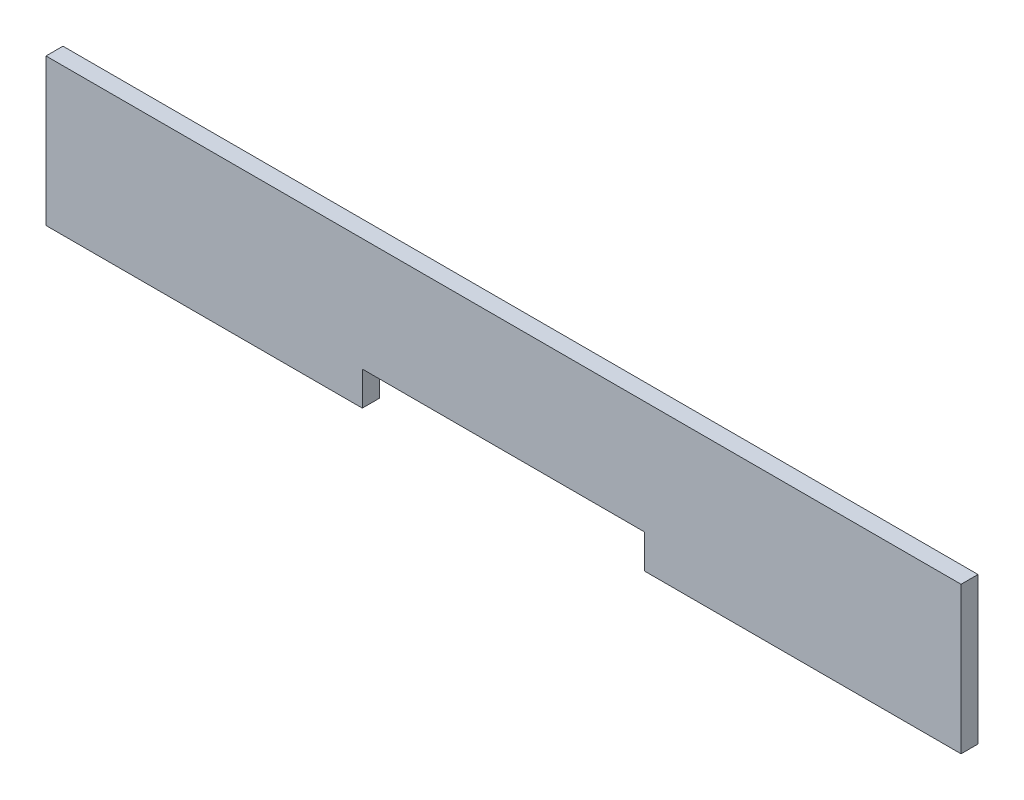
ISO-10303-21;
HEADER;
FILE_DESCRIPTION(('STEP AP214'),'2;1');
FILE_NAME('part.step','',(''),(''),'','','');
FILE_SCHEMA(('AUTOMOTIVE_DESIGN { 1 0 10303 214 1 1 1 1 }'));
ENDSEC;
DATA;
#1=APPLICATION_CONTEXT('core data for automotive mechanical design processes');
#2=APPLICATION_PROTOCOL_DEFINITION('international standard','automotive_design',2000,#1);
#3=PRODUCT_CONTEXT('',#1,'mechanical');
#4=PRODUCT('Part','Part','',(#3));
#5=PRODUCT_RELATED_PRODUCT_CATEGORY('part','',(#4));
#6=PRODUCT_DEFINITION_FORMATION('','',#4);
#7=PRODUCT_DEFINITION_CONTEXT('part definition',#1,'design');
#8=PRODUCT_DEFINITION('design','',#6,#7);
#9=PRODUCT_DEFINITION_SHAPE('','',#8);
#10=(LENGTH_UNIT() NAMED_UNIT(*) SI_UNIT(.MILLI.,.METRE.));
#11=(NAMED_UNIT(*) PLANE_ANGLE_UNIT() SI_UNIT($,.RADIAN.));
#12=(NAMED_UNIT(*) SI_UNIT($,.STERADIAN.) SOLID_ANGLE_UNIT());
#13=UNCERTAINTY_MEASURE_WITH_UNIT(LENGTH_MEASURE(1.E-05),#10,'distance_accuracy_value','');
#14=(GEOMETRIC_REPRESENTATION_CONTEXT(3) GLOBAL_UNCERTAINTY_ASSIGNED_CONTEXT((#13)) GLOBAL_UNIT_ASSIGNED_CONTEXT((#10,
#11,#12)) REPRESENTATION_CONTEXT('',''));
#15=CARTESIAN_POINT('',(0.,0.,0.));
#16=DIRECTION('',(0.,0.,1.));
#17=DIRECTION('',(1.,0.,0.));
#18=AXIS2_PLACEMENT_3D('',#15,#16,#17);
#19=CARTESIAN_POINT('',(0.,26.,3.));
#20=DIRECTION('',(1.,0.,0.));
#21=DIRECTION('',(0.,1.,0.));
#22=AXIS2_PLACEMENT_3D('',#19,#20,#21);
#23=PLANE('',#22);
#24=DIRECTION('',(0.,-1.,0.));
#25=VECTOR('',#24,1.);
#26=CARTESIAN_POINT('',(0.,26.,0.));
#27=LINE('',#26,#25);
#28=CARTESIAN_POINT('',(0.,26.,0.));
#29=VERTEX_POINT('',#28);
#30=CARTESIAN_POINT('',(0.,0.,0.));
#31=VERTEX_POINT('',#30);
#32=EDGE_CURVE('E139',#29,#31,#27,.T.);
#33=ORIENTED_EDGE('',*,*,#32,.T.);
#34=DIRECTION('',(0.,0.,-1.));
#35=VECTOR('',#34,1.);
#36=CARTESIAN_POINT('',(0.,0.,3.));
#37=LINE('',#36,#35);
#38=CARTESIAN_POINT('',(0.,0.,3.));
#39=VERTEX_POINT('',#38);
#40=EDGE_CURVE('E11',#39,#31,#37,.T.);
#41=ORIENTED_EDGE('',*,*,#40,.F.);
#42=DIRECTION('',(0.,-1.,0.));
#43=VECTOR('',#42,1.);
#44=CARTESIAN_POINT('',(0.,26.,3.));
#45=LINE('',#44,#43);
#46=CARTESIAN_POINT('',(0.,26.,3.));
#47=VERTEX_POINT('',#46);
#48=EDGE_CURVE('E161',#47,#39,#45,.T.);
#49=ORIENTED_EDGE('',*,*,#48,.F.);
#50=DIRECTION('',(0.,0.,-1.));
#51=VECTOR('',#50,1.);
#52=CARTESIAN_POINT('',(0.,26.,3.));
#53=LINE('',#52,#51);
#54=EDGE_CURVE('E135',#47,#29,#53,.T.);
#55=ORIENTED_EDGE('',*,*,#54,.T.);
#56=EDGE_LOOP('',(#33,#41,#49,#55));
#57=FACE_BOUND('',#56,.T.);
#58=ADVANCED_FACE('F38',(#57),#23,.F.);
#59=CARTESIAN_POINT('',(0.,0.,3.));
#60=DIRECTION('',(0.,1.,0.));
#61=DIRECTION('',(0.,0.,1.));
#62=AXIS2_PLACEMENT_3D('',#59,#60,#61);
#63=PLANE('',#62);
#64=DIRECTION('',(1.,0.,0.));
#65=VECTOR('',#64,1.);
#66=CARTESIAN_POINT('',(0.,0.,0.));
#67=LINE('',#66,#65);
#68=CARTESIAN_POINT('',(56.,0.,0.));
#69=VERTEX_POINT('',#68);
#70=EDGE_CURVE('E143',#31,#69,#67,.T.);
#71=ORIENTED_EDGE('',*,*,#70,.T.);
#72=DIRECTION('',(0.,0.,-1.));
#73=VECTOR('',#72,1.);
#74=CARTESIAN_POINT('',(56.,0.,3.));
#75=LINE('',#74,#73);
#76=CARTESIAN_POINT('',(56.,0.,3.));
#77=VERTEX_POINT('',#76);
#78=EDGE_CURVE('E47',#77,#69,#75,.T.);
#79=ORIENTED_EDGE('',*,*,#78,.F.);
#80=DIRECTION('',(1.,0.,0.));
#81=VECTOR('',#80,1.);
#82=CARTESIAN_POINT('',(0.,0.,3.));
#83=LINE('',#82,#81);
#84=EDGE_CURVE('E98',#39,#77,#83,.T.);
#85=ORIENTED_EDGE('',*,*,#84,.F.);
#86=ORIENTED_EDGE('',*,*,#40,.T.);
#87=EDGE_LOOP('',(#71,#79,#85,#86));
#88=FACE_BOUND('',#87,.T.);
#89=ADVANCED_FACE('F207',(#88),#63,.F.);
#90=CARTESIAN_POINT('',(56.,0.,3.));
#91=DIRECTION('',(-1.,0.,0.));
#92=DIRECTION('',(0.,0.,1.));
#93=AXIS2_PLACEMENT_3D('',#90,#91,#92);
#94=PLANE('',#93);
#95=DIRECTION('',(0.,1.,0.));
#96=VECTOR('',#95,1.);
#97=CARTESIAN_POINT('',(56.,0.,0.));
#98=LINE('',#97,#96);
#99=CARTESIAN_POINT('',(56.,6.,0.));
#100=VERTEX_POINT('',#99);
#101=EDGE_CURVE('E146',#69,#100,#98,.T.);
#102=ORIENTED_EDGE('',*,*,#101,.T.);
#103=DIRECTION('',(0.,0.,-1.));
#104=VECTOR('',#103,1.);
#105=CARTESIAN_POINT('',(56.,6.,3.));
#106=LINE('',#105,#104);
#107=CARTESIAN_POINT('',(56.,6.,3.));
#108=VERTEX_POINT('',#107);
#109=EDGE_CURVE('E172',#108,#100,#106,.T.);
#110=ORIENTED_EDGE('',*,*,#109,.F.);
#111=DIRECTION('',(0.,1.,0.));
#112=VECTOR('',#111,1.);
#113=CARTESIAN_POINT('',(56.,0.,3.));
#114=LINE('',#113,#112);
#115=EDGE_CURVE('E182',#77,#108,#114,.T.);
#116=ORIENTED_EDGE('',*,*,#115,.F.);
#117=ORIENTED_EDGE('',*,*,#78,.T.);
#118=EDGE_LOOP('',(#102,#110,#116,#117));
#119=FACE_BOUND('',#118,.T.);
#120=ADVANCED_FACE('F180',(#119),#94,.F.);
#121=CARTESIAN_POINT('',(56.,6.,3.));
#122=DIRECTION('',(0.,1.,0.));
#123=DIRECTION('',(0.,0.,1.));
#124=AXIS2_PLACEMENT_3D('',#121,#122,#123);
#125=PLANE('',#124);
#126=DIRECTION('',(1.,0.,0.));
#127=VECTOR('',#126,1.);
#128=CARTESIAN_POINT('',(56.,6.,0.));
#129=LINE('',#128,#127);
#130=CARTESIAN_POINT('',(106.,6.,0.));
#131=VERTEX_POINT('',#130);
#132=EDGE_CURVE('E149',#100,#131,#129,.T.);
#133=ORIENTED_EDGE('',*,*,#132,.T.);
#134=DIRECTION('',(0.,0.,-1.));
#135=VECTOR('',#134,1.);
#136=CARTESIAN_POINT('',(106.,6.,3.));
#137=LINE('',#136,#135);
#138=CARTESIAN_POINT('',(106.,6.,3.));
#139=VERTEX_POINT('',#138);
#140=EDGE_CURVE('E168',#139,#131,#137,.T.);
#141=ORIENTED_EDGE('',*,*,#140,.F.);
#142=DIRECTION('',(1.,0.,0.));
#143=VECTOR('',#142,1.);
#144=CARTESIAN_POINT('',(56.,6.,3.));
#145=LINE('',#144,#143);
#146=EDGE_CURVE('E195',#108,#139,#145,.T.);
#147=ORIENTED_EDGE('',*,*,#146,.F.);
#148=ORIENTED_EDGE('',*,*,#109,.T.);
#149=EDGE_LOOP('',(#133,#141,#147,#148));
#150=FACE_BOUND('',#149,.T.);
#151=ADVANCED_FACE('F190',(#150),#125,.F.);
#152=CARTESIAN_POINT('',(106.,6.,3.));
#153=DIRECTION('',(1.,0.,0.));
#154=DIRECTION('',(0.,0.,-1.));
#155=AXIS2_PLACEMENT_3D('',#152,#153,#154);
#156=PLANE('',#155);
#157=DIRECTION('',(0.,-1.,0.));
#158=VECTOR('',#157,1.);
#159=CARTESIAN_POINT('',(106.,6.,0.));
#160=LINE('',#159,#158);
#161=CARTESIAN_POINT('',(106.,0.,0.));
#162=VERTEX_POINT('',#161);
#163=EDGE_CURVE('E152',#131,#162,#160,.T.);
#164=ORIENTED_EDGE('',*,*,#163,.T.);
#165=DIRECTION('',(0.,0.,-1.));
#166=VECTOR('',#165,1.);
#167=CARTESIAN_POINT('',(106.,0.,3.));
#168=LINE('',#167,#166);
#169=CARTESIAN_POINT('',(106.,0.,3.));
#170=VERTEX_POINT('',#169);
#171=EDGE_CURVE('E128',#170,#162,#168,.T.);
#172=ORIENTED_EDGE('',*,*,#171,.F.);
#173=DIRECTION('',(0.,-1.,0.));
#174=VECTOR('',#173,1.);
#175=CARTESIAN_POINT('',(106.,6.,3.));
#176=LINE('',#175,#174);
#177=EDGE_CURVE('E117',#139,#170,#176,.T.);
#178=ORIENTED_EDGE('',*,*,#177,.F.);
#179=ORIENTED_EDGE('',*,*,#140,.T.);
#180=EDGE_LOOP('',(#164,#172,#178,#179));
#181=FACE_BOUND('',#180,.T.);
#182=ADVANCED_FACE('F193',(#181),#156,.F.);
#183=CARTESIAN_POINT('',(106.,0.,3.));
#184=DIRECTION('',(0.,1.,0.));
#185=DIRECTION('',(0.,0.,1.));
#186=AXIS2_PLACEMENT_3D('',#183,#184,#185);
#187=PLANE('',#186);
#188=DIRECTION('',(1.,0.,0.));
#189=VECTOR('',#188,1.);
#190=CARTESIAN_POINT('',(106.,0.,0.));
#191=LINE('',#190,#189);
#192=CARTESIAN_POINT('',(162.,0.,0.));
#193=VERTEX_POINT('',#192);
#194=EDGE_CURVE('E126',#162,#193,#191,.T.);
#195=ORIENTED_EDGE('',*,*,#194,.T.);
#196=DIRECTION('',(0.,0.,-1.));
#197=VECTOR('',#196,1.);
#198=CARTESIAN_POINT('',(162.,0.,3.));
#199=LINE('',#198,#197);
#200=CARTESIAN_POINT('',(162.,0.,3.));
#201=VERTEX_POINT('',#200);
#202=EDGE_CURVE('E123',#201,#193,#199,.T.);
#203=ORIENTED_EDGE('',*,*,#202,.F.);
#204=DIRECTION('',(1.,0.,0.));
#205=VECTOR('',#204,1.);
#206=CARTESIAN_POINT('',(106.,0.,3.));
#207=LINE('',#206,#205);
#208=EDGE_CURVE('E111',#170,#201,#207,.T.);
#209=ORIENTED_EDGE('',*,*,#208,.F.);
#210=ORIENTED_EDGE('',*,*,#171,.T.);
#211=EDGE_LOOP('',(#195,#203,#209,#210));
#212=FACE_BOUND('',#211,.T.);
#213=ADVANCED_FACE('F124',(#212),#187,.F.);
#214=CARTESIAN_POINT('',(162.,0.,3.));
#215=DIRECTION('',(-1.,0.,0.));
#216=DIRECTION('',(0.,-1.,0.));
#217=AXIS2_PLACEMENT_3D('',#214,#215,#216);
#218=PLANE('',#217);
#219=DIRECTION('',(0.,1.,0.));
#220=VECTOR('',#219,1.);
#221=CARTESIAN_POINT('',(162.,0.,0.));
#222=LINE('',#221,#220);
#223=CARTESIAN_POINT('',(162.,26.,0.));
#224=VERTEX_POINT('',#223);
#225=EDGE_CURVE('E84',#193,#224,#222,.T.);
#226=ORIENTED_EDGE('',*,*,#225,.T.);
#227=DIRECTION('',(0.,0.,-1.));
#228=VECTOR('',#227,1.);
#229=CARTESIAN_POINT('',(162.,26.,3.));
#230=LINE('',#229,#228);
#231=CARTESIAN_POINT('',(162.,26.,3.));
#232=VERTEX_POINT('',#231);
#233=EDGE_CURVE('E129',#232,#224,#230,.T.);
#234=ORIENTED_EDGE('',*,*,#233,.F.);
#235=DIRECTION('',(0.,1.,0.));
#236=VECTOR('',#235,1.);
#237=CARTESIAN_POINT('',(162.,0.,3.));
#238=LINE('',#237,#236);
#239=EDGE_CURVE('E115',#201,#232,#238,.T.);
#240=ORIENTED_EDGE('',*,*,#239,.F.);
#241=ORIENTED_EDGE('',*,*,#202,.T.);
#242=EDGE_LOOP('',(#226,#234,#240,#241));
#243=FACE_BOUND('',#242,.T.);
#244=ADVANCED_FACE('F131',(#243),#218,.F.);
#245=CARTESIAN_POINT('',(162.,26.,3.));
#246=DIRECTION('',(0.,-1.,0.));
#247=DIRECTION('',(1.,0.,0.));
#248=AXIS2_PLACEMENT_3D('',#245,#246,#247);
#249=PLANE('',#248);
#250=DIRECTION('',(-1.,0.,0.));
#251=VECTOR('',#250,1.);
#252=CARTESIAN_POINT('',(162.,26.,0.));
#253=LINE('',#252,#251);
#254=EDGE_CURVE('E90',#224,#29,#253,.T.);
#255=ORIENTED_EDGE('',*,*,#254,.T.);
#256=ORIENTED_EDGE('',*,*,#54,.F.);
#257=DIRECTION('',(-1.,0.,0.));
#258=VECTOR('',#257,1.);
#259=CARTESIAN_POINT('',(162.,26.,3.));
#260=LINE('',#259,#258);
#261=EDGE_CURVE('E55',#232,#47,#260,.T.);
#262=ORIENTED_EDGE('',*,*,#261,.F.);
#263=ORIENTED_EDGE('',*,*,#233,.T.);
#264=EDGE_LOOP('',(#255,#256,#262,#263));
#265=FACE_BOUND('',#264,.T.);
#266=ADVANCED_FACE('F223',(#265),#249,.F.);
#267=CARTESIAN_POINT('',(0.,0.,3.));
#268=DIRECTION('',(0.,0.,1.));
#269=DIRECTION('',(1.,0.,0.));
#270=AXIS2_PLACEMENT_3D('',#267,#268,#269);
#271=PLANE('',#270);
#272=ORIENTED_EDGE('',*,*,#48,.T.);
#273=ORIENTED_EDGE('',*,*,#84,.T.);
#274=ORIENTED_EDGE('',*,*,#115,.T.);
#275=ORIENTED_EDGE('',*,*,#146,.T.);
#276=ORIENTED_EDGE('',*,*,#177,.T.);
#277=ORIENTED_EDGE('',*,*,#208,.T.);
#278=ORIENTED_EDGE('',*,*,#239,.T.);
#279=ORIENTED_EDGE('',*,*,#261,.T.);
#280=EDGE_LOOP('',(#272,#273,#274,#275,#276,#277,#278,#279));
#281=FACE_BOUND('',#280,.T.);
#282=ADVANCED_FACE('F113',(#281),#271,.T.);
#283=CARTESIAN_POINT('',(0.,0.,0.));
#284=DIRECTION('',(0.,0.,1.));
#285=DIRECTION('',(1.,0.,0.));
#286=AXIS2_PLACEMENT_3D('',#283,#284,#285);
#287=PLANE('',#286);
#288=ORIENTED_EDGE('',*,*,#32,.F.);
#289=ORIENTED_EDGE('',*,*,#254,.F.);
#290=ORIENTED_EDGE('',*,*,#225,.F.);
#291=ORIENTED_EDGE('',*,*,#194,.F.);
#292=ORIENTED_EDGE('',*,*,#163,.F.);
#293=ORIENTED_EDGE('',*,*,#132,.F.);
#294=ORIENTED_EDGE('',*,*,#101,.F.);
#295=ORIENTED_EDGE('',*,*,#70,.F.);
#296=EDGE_LOOP('',(#288,#289,#290,#291,#292,#293,#294,#295));
#297=FACE_BOUND('',#296,.T.);
#298=ADVANCED_FACE('F186',(#297),#287,.F.);
#299=CLOSED_SHELL('',(#58,#89,#120,#151,#182,#213,#244,#266,#282,#298));
#300=MANIFOLD_SOLID_BREP('B2',#299);
#301=ADVANCED_BREP_SHAPE_REPRESENTATION('',(#18,#300),#14);
#302=SHAPE_DEFINITION_REPRESENTATION(#9,#301);
ENDSEC;
END-ISO-10303-21;
